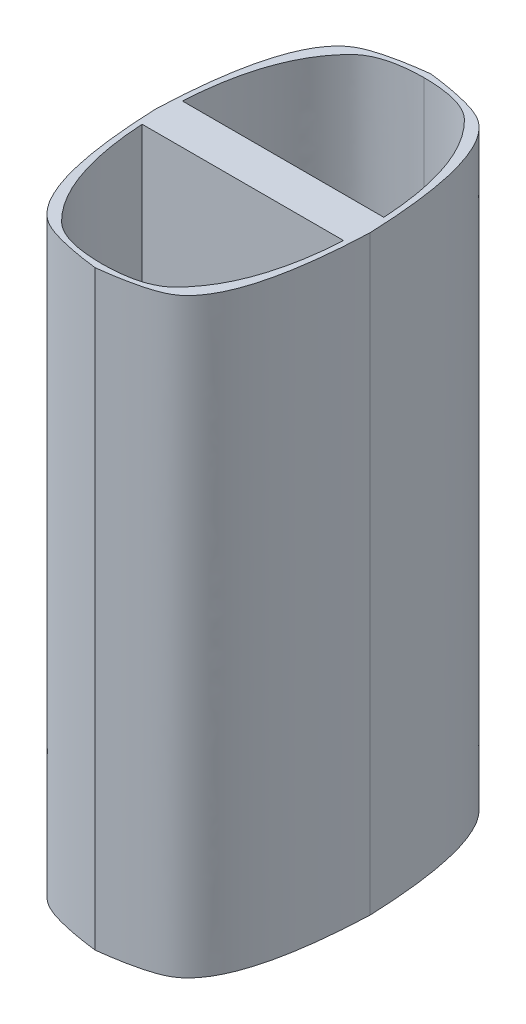
ISO-10303-21;
HEADER;
FILE_DESCRIPTION(('STEP AP214'),'2;1');
FILE_NAME('part.step','',(''),(''),'','','');
FILE_SCHEMA(('AUTOMOTIVE_DESIGN { 1 0 10303 214 1 1 1 1 }'));
ENDSEC;
DATA;
#1=APPLICATION_CONTEXT('core data for automotive mechanical design processes');
#2=APPLICATION_PROTOCOL_DEFINITION('international standard','automotive_design',2000,#1);
#3=PRODUCT_CONTEXT('',#1,'mechanical');
#4=PRODUCT('Part','Part','',(#3));
#5=PRODUCT_RELATED_PRODUCT_CATEGORY('part','',(#4));
#6=PRODUCT_DEFINITION_FORMATION('','',#4);
#7=PRODUCT_DEFINITION_CONTEXT('part definition',#1,'design');
#8=PRODUCT_DEFINITION('design','',#6,#7);
#9=PRODUCT_DEFINITION_SHAPE('','',#8);
#10=(LENGTH_UNIT() NAMED_UNIT(*) SI_UNIT(.MILLI.,.METRE.));
#11=(NAMED_UNIT(*) PLANE_ANGLE_UNIT() SI_UNIT($,.RADIAN.));
#12=(NAMED_UNIT(*) SI_UNIT($,.STERADIAN.) SOLID_ANGLE_UNIT());
#13=UNCERTAINTY_MEASURE_WITH_UNIT(LENGTH_MEASURE(1.E-05),#10,'distance_accuracy_value','');
#14=(GEOMETRIC_REPRESENTATION_CONTEXT(3) GLOBAL_UNCERTAINTY_ASSIGNED_CONTEXT((#13)) GLOBAL_UNIT_ASSIGNED_CONTEXT((#10,
#11,#12)) REPRESENTATION_CONTEXT('',''));
#15=CARTESIAN_POINT('',(0.,0.,0.));
#16=DIRECTION('',(0.,0.,1.));
#17=DIRECTION('',(1.,0.,0.));
#18=AXIS2_PLACEMENT_3D('',#15,#16,#17);
#19=CARTESIAN_POINT('',(-79.8033822620792,282.537692253008,-0.545630997433496));
#20=CARTESIAN_POINT('',(-76.0905755734626,282.537692253008,-94.7777397330235));
#21=CARTESIAN_POINT('',(-34.7352950813667,282.537692253008,-121.279132312119));
#22=CARTESIAN_POINT('',(0.196617737920855,282.537692253008,-125.545630997434));
#23=B_SPLINE_CURVE_WITH_KNOTS('',2,(#19,#20,#21,#22),.UNSPECIFIED.,.F.,.F.,(3,1,3),(0.,
0.708185096628253,1.),.UNSPECIFIED.);
#24=DIRECTION('',(0.,-1.,0.));
#25=VECTOR('',#24,1.);
#26=SURFACE_OF_LINEAR_EXTRUSION('',#23,#25);
#27=CARTESIAN_POINT('',(-79.8033822620792,-157.462307746992,-0.545630997433496));
#28=CARTESIAN_POINT('',(-76.0905755734626,-157.462307746992,-94.7777397330235));
#29=CARTESIAN_POINT('',(-34.7352950813667,-157.462307746992,-121.279132312119));
#30=CARTESIAN_POINT('',(0.196617737920855,-157.462307746992,-125.545630997434));
#31=B_SPLINE_CURVE_WITH_KNOTS('',2,(#27,#28,#29,#30),.UNSPECIFIED.,.F.,.F.,(3,1,3),(0.,
0.708185096628253,1.),.UNSPECIFIED.);
#32=CARTESIAN_POINT('',(-79.8033822620792,-157.462307746992,-0.545630997433496));
#33=VERTEX_POINT('',#32);
#34=CARTESIAN_POINT('',(-0.00207015770310974,-157.462307746992,-125.521313028584));
#35=VERTEX_POINT('',#34);
#36=EDGE_CURVE('E124',#33,#35,#31,.T.);
#37=ORIENTED_EDGE('',*,*,#36,.F.);
#38=DIRECTION('',(0.,-1.,0.));
#39=VECTOR('',#38,1.);
#40=CARTESIAN_POINT('',(-79.8033822620792,282.537692253008,-0.545630997433496));
#41=LINE('',#40,#39);
#42=CARTESIAN_POINT('',(-79.8033822620792,282.537692253008,-0.545630997433496));
#43=VERTEX_POINT('',#42);
#44=EDGE_CURVE('E11',#43,#33,#41,.T.);
#45=ORIENTED_EDGE('',*,*,#44,.F.);
#46=CARTESIAN_POINT('',(-0.00207015770310974,282.537692253008,-125.521313028584));
#47=VERTEX_POINT('',#46);
#48=EDGE_CURVE('E209',#43,#47,#23,.T.);
#49=ORIENTED_EDGE('',*,*,#48,.T.);
#50=DIRECTION('',(0.,-1.,0.));
#51=VECTOR('',#50,1.);
#52=CARTESIAN_POINT('',(-0.00207015770310974,282.537692253008,-125.521313028584));
#53=LINE('',#52,#51);
#54=EDGE_CURVE('E251',#47,#35,#53,.T.);
#55=ORIENTED_EDGE('',*,*,#54,.T.);
#56=EDGE_LOOP('',(#37,#45,#49,#55));
#57=FACE_BOUND('',#56,.T.);
#58=ADVANCED_FACE('F38',(#57),#26,.T.);
#59=CARTESIAN_POINT('',(-79.8033822620792,282.537692253008,-0.545630997433496));
#60=CARTESIAN_POINT('',(-76.0905755734626,282.537692253008,93.6864777381565));
#61=CARTESIAN_POINT('',(-34.7352950813667,282.537692253008,120.187870317252));
#62=CARTESIAN_POINT('',(0.196617737920855,282.537692253008,124.454369002567));
#63=B_SPLINE_CURVE_WITH_KNOTS('',2,(#59,#60,#61,#62),.UNSPECIFIED.,.F.,.F.,(3,1,3),(0.,
0.708185096628253,1.),.UNSPECIFIED.);
#64=DIRECTION('',(0.,-1.,0.));
#65=VECTOR('',#64,1.);
#66=SURFACE_OF_LINEAR_EXTRUSION('',#63,#65);
#67=CARTESIAN_POINT('',(-79.8033822620792,-157.462307746992,-0.545630997433496));
#68=CARTESIAN_POINT('',(-76.0905755734626,-157.462307746992,93.6864777381565));
#69=CARTESIAN_POINT('',(-34.7352950813667,-157.462307746992,120.187870317252));
#70=CARTESIAN_POINT('',(0.196617737920855,-157.462307746992,124.454369002567));
#71=B_SPLINE_CURVE_WITH_KNOTS('',2,(#67,#68,#69,#70),.UNSPECIFIED.,.F.,.F.,(3,1,3),(0.,
0.708185096628253,1.),.UNSPECIFIED.);
#72=CARTESIAN_POINT('',(-0.00207009542466512,-157.462307746992,124.430051033717));
#73=VERTEX_POINT('',#72);
#74=EDGE_CURVE('E259',#33,#73,#71,.T.);
#75=ORIENTED_EDGE('',*,*,#74,.T.);
#76=DIRECTION('',(0.,-1.,0.));
#77=VECTOR('',#76,1.);
#78=CARTESIAN_POINT('',(-0.00207009542466512,282.537692253008,124.430051033717));
#79=LINE('',#78,#77);
#80=CARTESIAN_POINT('',(-0.00207009542466512,282.537692253008,124.430051033717));
#81=VERTEX_POINT('',#80);
#82=EDGE_CURVE('E46',#81,#73,#79,.T.);
#83=ORIENTED_EDGE('',*,*,#82,.F.);
#84=EDGE_CURVE('E215',#43,#81,#63,.T.);
#85=ORIENTED_EDGE('',*,*,#84,.F.);
#86=ORIENTED_EDGE('',*,*,#44,.T.);
#87=EDGE_LOOP('',(#75,#83,#85,#86));
#88=FACE_BOUND('',#87,.T.);
#89=ADVANCED_FACE('F232',(#88),#66,.F.);
#90=CARTESIAN_POINT('',(79.7992420089514,282.537692253008,-0.545630997433516));
#91=CARTESIAN_POINT('',(76.0864353203349,282.537692253008,93.6864777381565));
#92=CARTESIAN_POINT('',(34.731154828239,282.537692253008,120.187870317252));
#93=CARTESIAN_POINT('',(-0.200757991048577,282.537692253008,124.454369002567));
#94=B_SPLINE_CURVE_WITH_KNOTS('',2,(#90,#91,#92,#93),.UNSPECIFIED.,.F.,.F.,(3,1,3),(0.,
0.708185096628253,1.),.UNSPECIFIED.);
#95=DIRECTION('',(0.,-1.,0.));
#96=VECTOR('',#95,1.);
#97=SURFACE_OF_LINEAR_EXTRUSION('',#94,#96);
#98=CARTESIAN_POINT('',(79.7992420089514,-157.462307746992,-0.545630997433516));
#99=CARTESIAN_POINT('',(76.0864353203349,-157.462307746992,93.6864777381565));
#100=CARTESIAN_POINT('',(34.731154828239,-157.462307746992,120.187870317252));
#101=CARTESIAN_POINT('',(-0.200757991048577,-157.462307746992,124.454369002567));
#102=B_SPLINE_CURVE_WITH_KNOTS('',2,(#98,#99,#100,#101),.UNSPECIFIED.,.F.,.F.,(3,1,3),(0.,
0.708185096628253,1.),.UNSPECIFIED.);
#103=CARTESIAN_POINT('',(79.7992420089514,-157.462307746992,-0.545630997433516));
#104=VERTEX_POINT('',#103);
#105=EDGE_CURVE('E267',#104,#73,#102,.T.);
#106=ORIENTED_EDGE('',*,*,#105,.F.);
#107=DIRECTION('',(0.,-1.,0.));
#108=VECTOR('',#107,1.);
#109=CARTESIAN_POINT('',(79.7992420089514,282.537692253008,-0.545630997433516));
#110=LINE('',#109,#108);
#111=CARTESIAN_POINT('',(79.7992420089514,282.537692253008,-0.545630997433516));
#112=VERTEX_POINT('',#111);
#113=EDGE_CURVE('E286',#112,#104,#110,.T.);
#114=ORIENTED_EDGE('',*,*,#113,.F.);
#115=EDGE_CURVE('E224',#112,#81,#94,.T.);
#116=ORIENTED_EDGE('',*,*,#115,.T.);
#117=ORIENTED_EDGE('',*,*,#82,.T.);
#118=EDGE_LOOP('',(#106,#114,#116,#117));
#119=FACE_BOUND('',#118,.T.);
#120=ADVANCED_FACE('F235',(#119),#97,.T.);
#121=CARTESIAN_POINT('',(79.7992420089514,282.537692253008,-0.545630997433516));
#122=CARTESIAN_POINT('',(76.0864353203349,282.537692253008,-94.7777397330235));
#123=CARTESIAN_POINT('',(34.731154828239,282.537692253008,-121.279132312119));
#124=CARTESIAN_POINT('',(-0.200757991048577,282.537692253008,-125.545630997434));
#125=B_SPLINE_CURVE_WITH_KNOTS('',2,(#121,#122,#123,#124),.UNSPECIFIED.,.F.,.F.,(3,1,3),(0.,
0.708185096628253,1.),.UNSPECIFIED.);
#126=DIRECTION('',(0.,-1.,0.));
#127=VECTOR('',#126,1.);
#128=SURFACE_OF_LINEAR_EXTRUSION('',#125,#127);
#129=CARTESIAN_POINT('',(79.7992420089514,-157.462307746992,-0.545630997433516));
#130=CARTESIAN_POINT('',(76.0864353203349,-157.462307746992,-94.7777397330235));
#131=CARTESIAN_POINT('',(34.731154828239,-157.462307746992,-121.279132312119));
#132=CARTESIAN_POINT('',(-0.200757991048577,-157.462307746992,-125.545630997434));
#133=B_SPLINE_CURVE_WITH_KNOTS('',2,(#129,#130,#131,#132),.UNSPECIFIED.,.F.,.F.,(3,1,3),(0.,
0.708185096628253,1.),.UNSPECIFIED.);
#134=EDGE_CURVE('E216',#104,#35,#133,.T.);
#135=ORIENTED_EDGE('',*,*,#134,.T.);
#136=ORIENTED_EDGE('',*,*,#54,.F.);
#137=EDGE_CURVE('E246',#112,#47,#125,.T.);
#138=ORIENTED_EDGE('',*,*,#137,.F.);
#139=ORIENTED_EDGE('',*,*,#113,.T.);
#140=EDGE_LOOP('',(#135,#136,#138,#139));
#141=FACE_BOUND('',#140,.T.);
#142=ADVANCED_FACE('F239',(#141),#128,.F.);
#143=CARTESIAN_POINT('',(-0.00207012656386087,282.537692253008,5.02627656524968));
#144=DIRECTION('',(0.,1.,0.));
#145=DIRECTION('',(0.,0.,1.));
#146=AXIS2_PLACEMENT_3D('',#143,#144,#145);
#147=PLANE('',#146);
#148=CARTESIAN_POINT('',(-75.0020701265639,282.537692253008,-15.5213130285837));
#149=CARTESIAN_POINT('',(-71.2892634379473,282.537692253008,-79.6232827790266));
#150=CARTESIAN_POINT('',(-29.9339829458514,282.537692253008,-120.429041594263));
#151=CARTESIAN_POINT('',(-0.00207012656386087,282.537692253008,-120.521313028584));
#152=B_SPLINE_CURVE_WITH_KNOTS('',2,(#148,#149,#150,#151),.UNSPECIFIED.,.F.,.F.,(3,1,3),(0.,
0.708185096628253,1.),.UNSPECIFIED.);
#153=CARTESIAN_POINT('',(-75.0020701265639,282.537692253008,-15.5213130285837));
#154=VERTEX_POINT('',#153);
#155=CARTESIAN_POINT('',(-0.00207012656386087,282.537692253008,-120.521313028584));
#156=VERTEX_POINT('',#155);
#157=EDGE_CURVE('E128',#154,#156,#152,.T.);
#158=ORIENTED_EDGE('',*,*,#157,.T.);
#159=CARTESIAN_POINT('',(74.9979298734361,282.537692253008,-15.5213130285837));
#160=CARTESIAN_POINT('',(71.2851231848196,282.537692253008,-79.6232827790266));
#161=CARTESIAN_POINT('',(29.9298426927237,282.537692253008,-120.429041594263));
#162=CARTESIAN_POINT('',(-0.00207012656386087,282.537692253008,-120.521313028584));
#163=B_SPLINE_CURVE_WITH_KNOTS('',2,(#159,#160,#161,#162),.UNSPECIFIED.,.F.,.F.,(3,1,3),(0.,
0.708185096628253,1.),.UNSPECIFIED.);
#164=CARTESIAN_POINT('',(74.9979298734361,282.537692253008,-15.5213130285837));
#165=VERTEX_POINT('',#164);
#166=EDGE_CURVE('E136',#165,#156,#163,.T.);
#167=ORIENTED_EDGE('',*,*,#166,.F.);
#168=DIRECTION('',(1.,0.,0.));
#169=VECTOR('',#168,1.);
#170=CARTESIAN_POINT('',(-0.00207012656386087,282.537692253008,-15.5213130285837));
#171=LINE('',#170,#169);
#172=EDGE_CURVE('E118',#154,#165,#171,.T.);
#173=ORIENTED_EDGE('',*,*,#172,.F.);
#174=EDGE_LOOP('',(#158,#167,#173));
#175=FACE_BOUND('',#174,.T.);
#176=CARTESIAN_POINT('',(74.9979298734361,282.537692253008,14.4300510337167));
#177=CARTESIAN_POINT('',(71.2851231848196,282.537692253008,78.5320207841596));
#178=CARTESIAN_POINT('',(29.9298426927237,282.537692253008,119.337779599396));
#179=CARTESIAN_POINT('',(-0.00207012656386087,282.537692253008,119.430051033717));
#180=B_SPLINE_CURVE_WITH_KNOTS('',2,(#176,#177,#178,#179),.UNSPECIFIED.,.F.,.F.,(3,1,3),(0.,
0.708185096628253,1.),.UNSPECIFIED.);
#181=CARTESIAN_POINT('',(74.9979298734361,282.537692253008,14.4300510337167));
#182=VERTEX_POINT('',#181);
#183=CARTESIAN_POINT('',(-0.00207012656386087,282.537692253008,119.430051033717));
#184=VERTEX_POINT('',#183);
#185=EDGE_CURVE('E201',#182,#184,#180,.T.);
#186=ORIENTED_EDGE('',*,*,#185,.T.);
#187=CARTESIAN_POINT('',(-75.0020701265639,282.537692253008,14.4300510337167));
#188=CARTESIAN_POINT('',(-71.2892634379473,282.537692253008,78.5320207841596));
#189=CARTESIAN_POINT('',(-29.9339829458514,282.537692253008,119.337779599396));
#190=CARTESIAN_POINT('',(-0.00207012656386087,282.537692253008,119.430051033717));
#191=B_SPLINE_CURVE_WITH_KNOTS('',2,(#187,#188,#189,#190),.UNSPECIFIED.,.F.,.F.,(3,1,3),(0.,
0.708185096628253,1.),.UNSPECIFIED.);
#192=CARTESIAN_POINT('',(-75.0020701265639,282.537692253008,14.4300510337167));
#193=VERTEX_POINT('',#192);
#194=EDGE_CURVE('E174',#193,#184,#191,.T.);
#195=ORIENTED_EDGE('',*,*,#194,.F.);
#196=DIRECTION('',(1.,0.,0.));
#197=VECTOR('',#196,1.);
#198=CARTESIAN_POINT('',(-0.00207012656386087,282.537692253008,14.4300510337167));
#199=LINE('',#198,#197);
#200=EDGE_CURVE('E61',#193,#182,#199,.T.);
#201=ORIENTED_EDGE('',*,*,#200,.T.);
#202=EDGE_LOOP('',(#186,#195,#201));
#203=FACE_BOUND('',#202,.T.);
#204=ORIENTED_EDGE('',*,*,#48,.F.);
#205=ORIENTED_EDGE('',*,*,#84,.T.);
#206=ORIENTED_EDGE('',*,*,#115,.F.);
#207=ORIENTED_EDGE('',*,*,#137,.T.);
#208=EDGE_LOOP('',(#204,#205,#206,#207));
#209=FACE_BOUND('',#208,.T.);
#210=ADVANCED_FACE('F134',(#175,#203,#209),#147,.T.);
#211=CARTESIAN_POINT('',(-0.00207012656386087,-157.462307746992,5.02627656524968));
#212=DIRECTION('',(0.,1.,0.));
#213=DIRECTION('',(0.,0.,1.));
#214=AXIS2_PLACEMENT_3D('',#211,#212,#213);
#215=PLANE('',#214);
#216=ORIENTED_EDGE('',*,*,#36,.T.);
#217=ORIENTED_EDGE('',*,*,#134,.F.);
#218=ORIENTED_EDGE('',*,*,#105,.T.);
#219=ORIENTED_EDGE('',*,*,#74,.F.);
#220=EDGE_LOOP('',(#216,#217,#218,#219));
#221=FACE_BOUND('',#220,.T.);
#222=ADVANCED_FACE('F244',(#221),#215,.F.);
#223=DIRECTION('',(0.,-1.,0.));
#224=VECTOR('',#223,1.);
#225=SURFACE_OF_LINEAR_EXTRUSION('',#180,#224);
#226=CARTESIAN_POINT('',(74.9979298734361,-117.462307746992,14.4300510337167));
#227=CARTESIAN_POINT('',(71.2851231848196,-117.462307746992,78.5320207841596));
#228=CARTESIAN_POINT('',(29.9298426927237,-117.462307746992,119.337779599396));
#229=CARTESIAN_POINT('',(-0.00207012656386087,-117.462307746992,119.430051033717));
#230=B_SPLINE_CURVE_WITH_KNOTS('',2,(#226,#227,#228,#229),.UNSPECIFIED.,.F.,.F.,(3,1,3),(0.,
0.708185096628253,1.),.UNSPECIFIED.);
#231=CARTESIAN_POINT('',(74.9979298734361,-117.462307746992,14.4300510337167));
#232=VERTEX_POINT('',#231);
#233=CARTESIAN_POINT('',(-0.00207012656386087,-117.462307746992,119.430051033717));
#234=VERTEX_POINT('',#233);
#235=EDGE_CURVE('E182',#232,#234,#230,.T.);
#236=ORIENTED_EDGE('',*,*,#235,.T.);
#237=DIRECTION('',(0.,-1.,0.));
#238=VECTOR('',#237,1.);
#239=CARTESIAN_POINT('',(-0.00207012656386087,282.537692253008,119.430051033717));
#240=LINE('',#239,#238);
#241=EDGE_CURVE('E180',#184,#234,#240,.T.);
#242=ORIENTED_EDGE('',*,*,#241,.F.);
#243=ORIENTED_EDGE('',*,*,#185,.F.);
#244=DIRECTION('',(0.,-1.,0.));
#245=VECTOR('',#244,1.);
#246=CARTESIAN_POINT('',(74.9979298734361,282.537692253008,14.4300510337167));
#247=LINE('',#246,#245);
#248=EDGE_CURVE('E208',#182,#232,#247,.T.);
#249=ORIENTED_EDGE('',*,*,#248,.T.);
#250=EDGE_LOOP('',(#236,#242,#243,#249));
#251=FACE_BOUND('',#250,.T.);
#252=ADVANCED_FACE('F327',(#251),#225,.F.);
#253=CARTESIAN_POINT('',(-0.00207012656386087,282.537692253008,14.4300510337167));
#254=DIRECTION('',(0.,0.,-1.));
#255=DIRECTION('',(-1.,0.,0.));
#256=AXIS2_PLACEMENT_3D('',#253,#254,#255);
#257=PLANE('',#256);
#258=DIRECTION('',(1.,0.,0.));
#259=VECTOR('',#258,1.);
#260=CARTESIAN_POINT('',(-0.00207012656386087,-117.462307746992,14.4300510337167));
#261=LINE('',#260,#259);
#262=CARTESIAN_POINT('',(-75.0020701265639,-117.462307746992,14.4300510337167));
#263=VERTEX_POINT('',#262);
#264=EDGE_CURVE('E190',#263,#232,#261,.T.);
#265=ORIENTED_EDGE('',*,*,#264,.T.);
#266=ORIENTED_EDGE('',*,*,#248,.F.);
#267=ORIENTED_EDGE('',*,*,#200,.F.);
#268=DIRECTION('',(0.,-1.,0.));
#269=VECTOR('',#268,1.);
#270=CARTESIAN_POINT('',(-75.0020701265639,282.537692253008,14.4300510337167));
#271=LINE('',#270,#269);
#272=EDGE_CURVE('E206',#193,#263,#271,.T.);
#273=ORIENTED_EDGE('',*,*,#272,.T.);
#274=EDGE_LOOP('',(#265,#266,#267,#273));
#275=FACE_BOUND('',#274,.T.);
#276=ADVANCED_FACE('F171',(#275),#257,.F.);
#277=DIRECTION('',(0.,-1.,0.));
#278=VECTOR('',#277,1.);
#279=SURFACE_OF_LINEAR_EXTRUSION('',#191,#278);
#280=CARTESIAN_POINT('',(-75.0020701265639,-117.462307746992,14.4300510337167));
#281=CARTESIAN_POINT('',(-71.2892634379473,-117.462307746992,78.5320207841596));
#282=CARTESIAN_POINT('',(-29.9339829458514,-117.462307746992,119.337779599396));
#283=CARTESIAN_POINT('',(-0.00207012656386087,-117.462307746992,119.430051033717));
#284=B_SPLINE_CURVE_WITH_KNOTS('',2,(#280,#281,#282,#283),.UNSPECIFIED.,.F.,.F.,(3,1,3),(0.,
0.708185096628253,1.),.UNSPECIFIED.);
#285=EDGE_CURVE('E196',#263,#234,#284,.T.);
#286=ORIENTED_EDGE('',*,*,#285,.F.);
#287=ORIENTED_EDGE('',*,*,#272,.F.);
#288=ORIENTED_EDGE('',*,*,#194,.T.);
#289=ORIENTED_EDGE('',*,*,#241,.T.);
#290=EDGE_LOOP('',(#286,#287,#288,#289));
#291=FACE_BOUND('',#290,.T.);
#292=ADVANCED_FACE('F166',(#291),#279,.T.);
#293=CARTESIAN_POINT('',(-0.00207012656386087,-117.462307746992,5.02627656524968));
#294=DIRECTION('',(0.,1.,0.));
#295=DIRECTION('',(0.,0.,1.));
#296=AXIS2_PLACEMENT_3D('',#293,#294,#295);
#297=PLANE('',#296);
#298=ORIENTED_EDGE('',*,*,#235,.F.);
#299=ORIENTED_EDGE('',*,*,#264,.F.);
#300=ORIENTED_EDGE('',*,*,#285,.T.);
#301=EDGE_LOOP('',(#298,#299,#300));
#302=FACE_BOUND('',#301,.T.);
#303=ADVANCED_FACE('F163',(#302),#297,.T.);
#304=DIRECTION('',(0.,-1.,0.));
#305=VECTOR('',#304,1.);
#306=SURFACE_OF_LINEAR_EXTRUSION('',#152,#305);
#307=CARTESIAN_POINT('',(-75.0020701265639,-117.462307746992,-15.5213130285837));
#308=CARTESIAN_POINT('',(-71.2892634379473,-117.462307746992,-79.6232827790266));
#309=CARTESIAN_POINT('',(-29.9339829458514,-117.462307746992,-120.429041594263));
#310=CARTESIAN_POINT('',(-0.00207012656386087,-117.462307746992,-120.521313028584));
#311=B_SPLINE_CURVE_WITH_KNOTS('',2,(#307,#308,#309,#310),.UNSPECIFIED.,.F.,.F.,(3,1,3),(0.,
0.708185096628253,1.),.UNSPECIFIED.);
#312=CARTESIAN_POINT('',(-75.0020701265639,-117.462307746992,-15.5213130285837));
#313=VERTEX_POINT('',#312);
#314=CARTESIAN_POINT('',(-0.00207012656386087,-117.462307746992,-120.521313028584));
#315=VERTEX_POINT('',#314);
#316=EDGE_CURVE('E146',#313,#315,#311,.T.);
#317=ORIENTED_EDGE('',*,*,#316,.T.);
#318=DIRECTION('',(0.,-1.,0.));
#319=VECTOR('',#318,1.);
#320=CARTESIAN_POINT('',(-0.00207012656386087,282.537692253008,-120.521313028584));
#321=LINE('',#320,#319);
#322=EDGE_CURVE('E130',#156,#315,#321,.T.);
#323=ORIENTED_EDGE('',*,*,#322,.F.);
#324=ORIENTED_EDGE('',*,*,#157,.F.);
#325=DIRECTION('',(0.,-1.,0.));
#326=VECTOR('',#325,1.);
#327=CARTESIAN_POINT('',(-75.0020701265639,282.537692253008,-15.5213130285837));
#328=LINE('',#327,#326);
#329=EDGE_CURVE('E114',#154,#313,#328,.T.);
#330=ORIENTED_EDGE('',*,*,#329,.T.);
#331=EDGE_LOOP('',(#317,#323,#324,#330));
#332=FACE_BOUND('',#331,.T.);
#333=ADVANCED_FACE('F129',(#332),#306,.F.);
#334=CARTESIAN_POINT('',(-0.00207012656386087,282.537692253008,-15.5213130285837));
#335=DIRECTION('',(0.,0.,-1.));
#336=DIRECTION('',(-1.,0.,0.));
#337=AXIS2_PLACEMENT_3D('',#334,#335,#336);
#338=PLANE('',#337);
#339=DIRECTION('',(1.,0.,0.));
#340=VECTOR('',#339,1.);
#341=CARTESIAN_POINT('',(-0.00207012656386087,-117.462307746992,-15.5213130285837));
#342=LINE('',#341,#340);
#343=CARTESIAN_POINT('',(74.9979298734361,-117.462307746992,-15.5213130285837));
#344=VERTEX_POINT('',#343);
#345=EDGE_CURVE('E120',#313,#344,#342,.T.);
#346=ORIENTED_EDGE('',*,*,#345,.F.);
#347=ORIENTED_EDGE('',*,*,#329,.F.);
#348=ORIENTED_EDGE('',*,*,#172,.T.);
#349=DIRECTION('',(0.,-1.,0.));
#350=VECTOR('',#349,1.);
#351=CARTESIAN_POINT('',(74.9979298734361,282.537692253008,-15.5213130285837));
#352=LINE('',#351,#350);
#353=EDGE_CURVE('E53',#165,#344,#352,.T.);
#354=ORIENTED_EDGE('',*,*,#353,.T.);
#355=EDGE_LOOP('',(#346,#347,#348,#354));
#356=FACE_BOUND('',#355,.T.);
#357=ADVANCED_FACE('F116',(#356),#338,.T.);
#358=DIRECTION('',(0.,-1.,0.));
#359=VECTOR('',#358,1.);
#360=SURFACE_OF_LINEAR_EXTRUSION('',#163,#359);
#361=CARTESIAN_POINT('',(74.9979298734361,-117.462307746992,-15.5213130285837));
#362=CARTESIAN_POINT('',(71.2851231848196,-117.462307746992,-79.6232827790266));
#363=CARTESIAN_POINT('',(29.9298426927237,-117.462307746992,-120.429041594263));
#364=CARTESIAN_POINT('',(-0.00207012656386087,-117.462307746992,-120.521313028584));
#365=B_SPLINE_CURVE_WITH_KNOTS('',2,(#361,#362,#363,#364),.UNSPECIFIED.,.F.,.F.,(3,1,3),(0.,
0.708185096628253,1.),.UNSPECIFIED.);
#366=EDGE_CURVE('E132',#344,#315,#365,.T.);
#367=ORIENTED_EDGE('',*,*,#366,.F.);
#368=ORIENTED_EDGE('',*,*,#353,.F.);
#369=ORIENTED_EDGE('',*,*,#166,.T.);
#370=ORIENTED_EDGE('',*,*,#322,.T.);
#371=EDGE_LOOP('',(#367,#368,#369,#370));
#372=FACE_BOUND('',#371,.T.);
#373=ADVANCED_FACE('F154',(#372),#360,.T.);
#374=CARTESIAN_POINT('',(-0.00207012656386087,-117.462307746992,5.02627656524968));
#375=DIRECTION('',(0.,1.,0.));
#376=DIRECTION('',(0.,0.,1.));
#377=AXIS2_PLACEMENT_3D('',#374,#375,#376);
#378=PLANE('',#377);
#379=ORIENTED_EDGE('',*,*,#316,.F.);
#380=ORIENTED_EDGE('',*,*,#345,.T.);
#381=ORIENTED_EDGE('',*,*,#366,.T.);
#382=EDGE_LOOP('',(#379,#380,#381));
#383=FACE_BOUND('',#382,.T.);
#384=ADVANCED_FACE('F158',(#383),#378,.T.);
#385=CLOSED_SHELL('',(#58,#89,#120,#142,#210,#222,#252,#276,#292,#303,#333,#357,#373,#384));
#386=MANIFOLD_SOLID_BREP('B2',#385);
#387=ADVANCED_BREP_SHAPE_REPRESENTATION('',(#18,#386),#14);
#388=SHAPE_DEFINITION_REPRESENTATION(#9,#387);
ENDSEC;
END-ISO-10303-21;
